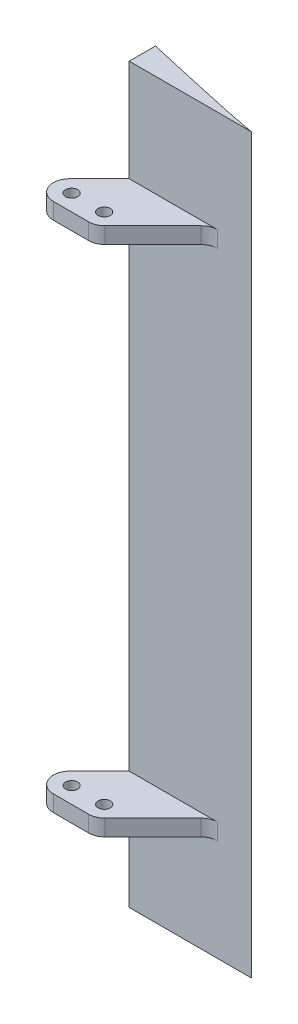
ISO-10303-21;
HEADER;
FILE_DESCRIPTION(('STEP AP214'),'2;1');
FILE_NAME('part.step','',(''),(''),'','','');
FILE_SCHEMA(('AUTOMOTIVE_DESIGN { 1 0 10303 214 1 1 1 1 }'));
ENDSEC;
DATA;
#1=APPLICATION_CONTEXT('core data for automotive mechanical design processes');
#2=APPLICATION_PROTOCOL_DEFINITION('international standard','automotive_design',2000,#1);
#3=PRODUCT_CONTEXT('',#1,'mechanical');
#4=PRODUCT('Part','Part','',(#3));
#5=PRODUCT_RELATED_PRODUCT_CATEGORY('part','',(#4));
#6=PRODUCT_DEFINITION_FORMATION('','',#4);
#7=PRODUCT_DEFINITION_CONTEXT('part definition',#1,'design');
#8=PRODUCT_DEFINITION('design','',#6,#7);
#9=PRODUCT_DEFINITION_SHAPE('','',#8);
#10=(LENGTH_UNIT() NAMED_UNIT(*) SI_UNIT(.MILLI.,.METRE.));
#11=(NAMED_UNIT(*) PLANE_ANGLE_UNIT() SI_UNIT($,.RADIAN.));
#12=(NAMED_UNIT(*) SI_UNIT($,.STERADIAN.) SOLID_ANGLE_UNIT());
#13=UNCERTAINTY_MEASURE_WITH_UNIT(LENGTH_MEASURE(1.E-05),#10,'distance_accuracy_value','');
#14=(GEOMETRIC_REPRESENTATION_CONTEXT(3) GLOBAL_UNCERTAINTY_ASSIGNED_CONTEXT((#13)) GLOBAL_UNIT_ASSIGNED_CONTEXT((#10,
#11,#12)) REPRESENTATION_CONTEXT('',''));
#15=CARTESIAN_POINT('',(0.,0.,0.));
#16=DIRECTION('',(0.,0.,1.));
#17=DIRECTION('',(1.,0.,0.));
#18=AXIS2_PLACEMENT_3D('',#15,#16,#17);
#19=CARTESIAN_POINT('',(-23.8351605851665,100.,0.));
#20=DIRECTION('',(0.,0.,-1.));
#21=DIRECTION('',(-1.,0.,0.));
#22=AXIS2_PLACEMENT_3D('',#19,#20,#21);
#23=PLANE('',#22);
#24=DIRECTION('',(1.,0.,0.));
#25=VECTOR('',#24,1.);
#26=CARTESIAN_POINT('',(11.1648394148335,19.5,0.));
#27=LINE('',#26,#25);
#28=CARTESIAN_POINT('',(11.1648394148335,19.5,0.));
#29=VERTEX_POINT('',#28);
#30=CARTESIAN_POINT('',(21.9932665395797,19.5,0.));
#31=VERTEX_POINT('',#30);
#32=EDGE_CURVE('E193',#29,#31,#27,.T.);
#33=ORIENTED_EDGE('',*,*,#32,.T.);
#34=DIRECTION('',(0.,1.,0.));
#35=VECTOR('',#34,1.);
#36=CARTESIAN_POINT('',(21.9932665395797,17.5,0.));
#37=LINE('',#36,#35);
#38=CARTESIAN_POINT('',(21.9932665395797,17.5,0.));
#39=VERTEX_POINT('',#38);
#40=EDGE_CURVE('E191',#31,#39,#37,.F.);
#41=ORIENTED_EDGE('',*,*,#40,.T.);
#42=DIRECTION('',(1.,0.,0.));
#43=VECTOR('',#42,1.);
#44=CARTESIAN_POINT('',(11.1648394148335,17.5,0.));
#45=LINE('',#44,#43);
#46=CARTESIAN_POINT('',(11.1648394148335,17.5,0.));
#47=VERTEX_POINT('',#46);
#48=EDGE_CURVE('E161',#47,#39,#45,.T.);
#49=ORIENTED_EDGE('',*,*,#48,.F.);
#50=DIRECTION('',(0.,-1.,0.));
#51=VECTOR('',#50,1.);
#52=CARTESIAN_POINT('',(11.1648394148335,100.,0.));
#53=LINE('',#52,#51);
#54=CARTESIAN_POINT('',(11.1648394148335,5.,0.));
#55=VERTEX_POINT('',#54);
#56=EDGE_CURVE('E176',#47,#55,#53,.T.);
#57=ORIENTED_EDGE('',*,*,#56,.T.);
#58=DIRECTION('',(1.,0.,0.));
#59=VECTOR('',#58,1.);
#60=CARTESIAN_POINT('',(-23.8351605851665,5.,0.));
#61=LINE('',#60,#59);
#62=CARTESIAN_POINT('',(26.1648394148335,5.,0.));
#63=VERTEX_POINT('',#62);
#64=EDGE_CURVE('E188',#55,#63,#61,.T.);
#65=ORIENTED_EDGE('',*,*,#64,.T.);
#66=DIRECTION('',(0.,-1.,0.));
#67=VECTOR('',#66,1.);
#68=CARTESIAN_POINT('',(26.1648394148335,100.,0.));
#69=LINE('',#68,#67);
#70=CARTESIAN_POINT('',(26.1648394148335,95.,0.));
#71=VERTEX_POINT('',#70);
#72=EDGE_CURVE('E259',#71,#63,#69,.T.);
#73=ORIENTED_EDGE('',*,*,#72,.F.);
#74=DIRECTION('',(-1.,0.,0.));
#75=VECTOR('',#74,1.);
#76=CARTESIAN_POINT('',(-23.8351605851665,95.,0.));
#77=LINE('',#76,#75);
#78=CARTESIAN_POINT('',(11.1648394148335,95.,0.));
#79=VERTEX_POINT('',#78);
#80=EDGE_CURVE('E233',#71,#79,#77,.T.);
#81=ORIENTED_EDGE('',*,*,#80,.T.);
#82=CARTESIAN_POINT('',(11.1648394148335,82.5,0.));
#83=VERTEX_POINT('',#82);
#84=EDGE_CURVE('E240',#79,#83,#53,.T.);
#85=ORIENTED_EDGE('',*,*,#84,.T.);
#86=DIRECTION('',(1.,0.,0.));
#87=VECTOR('',#86,1.);
#88=CARTESIAN_POINT('',(11.1648394148335,82.5,0.));
#89=LINE('',#88,#87);
#90=CARTESIAN_POINT('',(21.9932665395797,82.5,0.));
#91=VERTEX_POINT('',#90);
#92=EDGE_CURVE('E214',#83,#91,#89,.T.);
#93=ORIENTED_EDGE('',*,*,#92,.T.);
#94=DIRECTION('',(0.,-1.,0.));
#95=VECTOR('',#94,1.);
#96=CARTESIAN_POINT('',(21.9932665395797,99.9999999999999,0.));
#97=LINE('',#96,#95);
#98=CARTESIAN_POINT('',(21.9932665395797,80.5,0.));
#99=VERTEX_POINT('',#98);
#100=EDGE_CURVE('E357',#91,#99,#97,.T.);
#101=ORIENTED_EDGE('',*,*,#100,.T.);
#102=DIRECTION('',(1.,0.,0.));
#103=VECTOR('',#102,1.);
#104=CARTESIAN_POINT('',(11.1648394148335,80.5,0.));
#105=LINE('',#104,#103);
#106=CARTESIAN_POINT('',(11.1648394148335,80.5,0.));
#107=VERTEX_POINT('',#106);
#108=EDGE_CURVE('E202',#107,#99,#105,.T.);
#109=ORIENTED_EDGE('',*,*,#108,.F.);
#110=EDGE_CURVE('E187',#107,#29,#53,.T.);
#111=ORIENTED_EDGE('',*,*,#110,.T.);
#112=EDGE_LOOP('',(#33,#41,#49,#57,#65,#73,#81,#85,#93,#101,#109,#111));
#113=FACE_BOUND('',#112,.T.);
#114=ADVANCED_FACE('F33',(#113),#23,.F.);
#115=CARTESIAN_POINT('',(26.1648394148335,100.,0.));
#116=CARTESIAN_POINT('',(19.211918985571,100.,-1.16258018784965));
#117=CARTESIAN_POINT('',(4.13271292978012,100.,-5.52501275167282));
#118=CARTESIAN_POINT('',(-8.85012049649564,100.,-5.77485183788265));
#119=CARTESIAN_POINT('',(-18.7383931036189,100.,-4.79326831168846));
#120=CARTESIAN_POINT('',(-22.278212261763,100.,-3.55358612755049));
#121=CARTESIAN_POINT('',(-24.2675788953221,100.,-1.25622054621105));
#122=B_SPLINE_CURVE_WITH_KNOTS('',3,(#115,#116,#117,#118,#119,#120,#121),.UNSPECIFIED.,.F.,.F.,
(4,1,1,1,4),(0.0219972250878111,0.49085189361201,0.815811168310364,0.866725978949163,1.),.UNSPECIFIED.);
#123=DIRECTION('',(0.,-1.,0.));
#124=VECTOR('',#123,1.);
#125=SURFACE_OF_LINEAR_EXTRUSION('',#122,#124);
#126=DIRECTION('',(0.,-1.,0.));
#127=VECTOR('',#126,1.);
#128=CARTESIAN_POINT('',(11.1648394148335,100.,-3.22712026169733));
#129=LINE('',#128,#127);
#130=CARTESIAN_POINT('',(11.1648394148347,5.00000000000002,-3.22712026169708));
#131=VERTEX_POINT('',#130);
#132=CARTESIAN_POINT('',(11.1648394148335,95.,-3.22712026169733));
#133=VERTEX_POINT('',#132);
#134=EDGE_CURVE('E248',#131,#133,#129,.F.);
#135=ORIENTED_EDGE('',*,*,#134,.T.);
#136=CARTESIAN_POINT('',(26.1648394148335,95.,0.));
#137=CARTESIAN_POINT('',(19.211918985571,95.,-1.16258018784965));
#138=CARTESIAN_POINT('',(4.13271292978012,95.,-5.52501275167282));
#139=CARTESIAN_POINT('',(-8.85012049649564,95.,-5.77485183788265));
#140=CARTESIAN_POINT('',(-18.7383931036189,95.,-4.79326831168846));
#141=CARTESIAN_POINT('',(-22.278212261763,95.,-3.55358612755049));
#142=CARTESIAN_POINT('',(-24.2675788953221,95.,-1.25622054621105));
#143=B_SPLINE_CURVE_WITH_KNOTS('',3,(#136,#137,#138,#139,#140,#141,#142),.UNSPECIFIED.,.F.,.F.,
(4,1,1,1,4),(0.0219972250878111,0.49085189361201,0.815811168310364,0.866725978949163,1.),.UNSPECIFIED.);
#144=EDGE_CURVE('E243',#133,#71,#143,.F.);
#145=ORIENTED_EDGE('',*,*,#144,.T.);
#146=ORIENTED_EDGE('',*,*,#72,.T.);
#147=CARTESIAN_POINT('',(26.1648394148335,5.00000000000002,0.));
#148=CARTESIAN_POINT('',(19.211918985571,5.00000000000002,-1.16258018784965));
#149=CARTESIAN_POINT('',(4.13271292978012,5.00000000000002,-5.52501275167282));
#150=CARTESIAN_POINT('',(-8.85012049649564,5.00000000000002,-5.77485183788265));
#151=CARTESIAN_POINT('',(-18.7383931036189,5.00000000000002,-4.79326831168846));
#152=CARTESIAN_POINT('',(-22.278212261763,5.00000000000002,-3.55358612755049));
#153=CARTESIAN_POINT('',(-24.2675788953221,5.00000000000002,-1.25622054621105));
#154=B_SPLINE_CURVE_WITH_KNOTS('',3,(#147,#148,#149,#150,#151,#152,#153),.UNSPECIFIED.,.F.,.F.,
(4,1,1,1,4),(0.0219972250878111,0.49085189361201,0.815811168310364,0.866725978949163,1.),.UNSPECIFIED.);
#155=EDGE_CURVE('E254',#63,#131,#154,.T.);
#156=ORIENTED_EDGE('',*,*,#155,.T.);
#157=EDGE_LOOP('',(#135,#145,#146,#156));
#158=FACE_BOUND('',#157,.T.);
#159=ADVANCED_FACE('F271',(#158),#125,.F.);
#160=CARTESIAN_POINT('',(26.1648394148335,95.,-90.));
#161=DIRECTION('',(0.,-1.,0.));
#162=DIRECTION('',(0.,0.,-1.));
#163=AXIS2_PLACEMENT_3D('',#160,#161,#162);
#164=PLANE('',#163);
#165=ORIENTED_EDGE('',*,*,#144,.F.);
#166=DIRECTION('',(0.,0.,1.));
#167=VECTOR('',#166,1.);
#168=CARTESIAN_POINT('',(11.1648394148335,95.,-90.));
#169=LINE('',#168,#167);
#170=EDGE_CURVE('E442',#133,#79,#169,.T.);
#171=ORIENTED_EDGE('',*,*,#170,.T.);
#172=ORIENTED_EDGE('',*,*,#80,.F.);
#173=EDGE_LOOP('',(#165,#171,#172));
#174=FACE_BOUND('',#173,.T.);
#175=ADVANCED_FACE('F275',(#174),#164,.F.);
#176=CARTESIAN_POINT('',(11.1648394148335,95.,-90.));
#177=DIRECTION('',(1.,0.,0.));
#178=DIRECTION('',(0.,1.,0.));
#179=AXIS2_PLACEMENT_3D('',#176,#177,#178);
#180=PLANE('',#179);
#181=ORIENTED_EDGE('',*,*,#170,.F.);
#182=ORIENTED_EDGE('',*,*,#134,.F.);
#183=DIRECTION('',(0.,0.,1.));
#184=VECTOR('',#183,1.);
#185=CARTESIAN_POINT('',(11.1648394148335,5.,-90.));
#186=LINE('',#185,#184);
#187=EDGE_CURVE('E183',#131,#55,#186,.T.);
#188=ORIENTED_EDGE('',*,*,#187,.T.);
#189=ORIENTED_EDGE('',*,*,#56,.F.);
#190=DIRECTION('',(0.,1.,0.));
#191=VECTOR('',#190,1.);
#192=CARTESIAN_POINT('',(11.1648394148335,17.5,0.));
#193=LINE('',#192,#191);
#194=EDGE_CURVE('E180',#47,#29,#193,.T.);
#195=ORIENTED_EDGE('',*,*,#194,.T.);
#196=ORIENTED_EDGE('',*,*,#110,.F.);
#197=DIRECTION('',(0.,-1.,0.));
#198=VECTOR('',#197,1.);
#199=CARTESIAN_POINT('',(11.1648394148335,82.5,0.));
#200=LINE('',#199,#198);
#201=EDGE_CURVE('E199',#83,#107,#200,.T.);
#202=ORIENTED_EDGE('',*,*,#201,.F.);
#203=ORIENTED_EDGE('',*,*,#84,.F.);
#204=EDGE_LOOP('',(#181,#182,#188,#189,#195,#196,#202,#203));
#205=FACE_BOUND('',#204,.T.);
#206=ADVANCED_FACE('F178',(#205),#180,.F.);
#207=CARTESIAN_POINT('',(26.1648394148335,5.,-90.));
#208=DIRECTION('',(0.,1.,0.));
#209=DIRECTION('',(0.,0.,1.));
#210=AXIS2_PLACEMENT_3D('',#207,#208,#209);
#211=PLANE('',#210);
#212=ORIENTED_EDGE('',*,*,#187,.F.);
#213=ORIENTED_EDGE('',*,*,#155,.F.);
#214=ORIENTED_EDGE('',*,*,#64,.F.);
#215=EDGE_LOOP('',(#212,#213,#214));
#216=FACE_BOUND('',#215,.T.);
#217=ADVANCED_FACE('F277',(#216),#211,.F.);
#218=CARTESIAN_POINT('',(4.09377160296798,82.5,7.07106781186539));
#219=DIRECTION('',(0.707106781186539,0.,0.707106781186556));
#220=DIRECTION('',(0.707106781186556,0.,-0.707106781186539));
#221=AXIS2_PLACEMENT_3D('',#218,#219,#220);
#222=PLANE('',#221);
#223=DIRECTION('',(0.707106781186556,0.,-0.707106781186539));
#224=VECTOR('',#223,1.);
#225=CARTESIAN_POINT('',(4.09377160296798,80.5,7.07106781186539));
#226=LINE('',#225,#224);
#227=CARTESIAN_POINT('',(7.50798516534116,80.5,3.65685424949228));
#228=VERTEX_POINT('',#227);
#229=EDGE_CURVE('E380',#228,#107,#226,.T.);
#230=ORIENTED_EDGE('',*,*,#229,.F.);
#231=DIRECTION('',(0.,-1.,0.));
#232=VECTOR('',#231,1.);
#233=CARTESIAN_POINT('',(7.50798516534116,82.5,3.65685424949228));
#234=LINE('',#233,#232);
#235=CARTESIAN_POINT('',(7.50798516534116,82.5,3.65685424949228));
#236=VERTEX_POINT('',#235);
#237=EDGE_CURVE('E50',#228,#236,#234,.F.);
#238=ORIENTED_EDGE('',*,*,#237,.T.);
#239=DIRECTION('',(0.707106781186556,0.,-0.707106781186539));
#240=VECTOR('',#239,1.);
#241=CARTESIAN_POINT('',(4.09377160296798,82.5,7.07106781186539));
#242=LINE('',#241,#240);
#243=EDGE_CURVE('E216',#236,#83,#242,.T.);
#244=ORIENTED_EDGE('',*,*,#243,.T.);
#245=ORIENTED_EDGE('',*,*,#201,.T.);
#246=EDGE_LOOP('',(#230,#238,#244,#245));
#247=FACE_BOUND('',#246,.T.);
#248=ADVANCED_FACE('F410',(#247),#222,.F.);
#249=CARTESIAN_POINT('',(4.09377160296798,80.5,7.07106781186539));
#250=DIRECTION('',(0.,1.,0.));
#251=DIRECTION('',(0.,0.,1.));
#252=AXIS2_PLACEMENT_3D('',#249,#250,#251);
#253=PLANE('',#252);
#254=CARTESIAN_POINT('',(13.1648394148335,80.5,5.07106781186539));
#255=DIRECTION('',(0.,1.,0.));
#256=DIRECTION('',(0.,0.,1.));
#257=AXIS2_PLACEMENT_3D('',#254,#255,#256);
#258=CIRCLE('',#257,0.75);
#259=CARTESIAN_POINT('',(13.1648394148335,80.5,5.8210678118654));
#260=VERTEX_POINT('',#259);
#261=EDGE_CURVE('E333',#260,#260,#258,.T.);
#262=ORIENTED_EDGE('',*,*,#261,.T.);
#263=EDGE_LOOP('',(#262));
#264=FACE_BOUND('',#263,.T.);
#265=CARTESIAN_POINT('',(9.16483941483353,80.5,5.07106781186539));
#266=DIRECTION('',(0.,1.,0.));
#267=DIRECTION('',(0.,0.,1.));
#268=AXIS2_PLACEMENT_3D('',#265,#266,#267);
#269=CIRCLE('',#268,0.75);
#270=CARTESIAN_POINT('',(9.16483941483353,80.5,5.8210678118654));
#271=VERTEX_POINT('',#270);
#272=EDGE_CURVE('E171',#271,#271,#269,.T.);
#273=ORIENTED_EDGE('',*,*,#272,.T.);
#274=EDGE_LOOP('',(#273));
#275=FACE_BOUND('',#274,.T.);
#276=DIRECTION('',(0.707106781186556,0.,-0.707106781186539));
#277=VECTOR('',#276,1.);
#278=CARTESIAN_POINT('',(14.093771602968,80.5,7.07106781186539));
#279=LINE('',#278,#277);
#280=CARTESIAN_POINT('',(14.6795580405949,80.5,6.48528137423851));
#281=VERTEX_POINT('',#280);
#282=CARTESIAN_POINT('',(20.5790529772066,80.5,0.585786437626891));
#283=VERTEX_POINT('',#282);
#284=EDGE_CURVE('E383',#281,#283,#279,.T.);
#285=ORIENTED_EDGE('',*,*,#284,.F.);
#286=CARTESIAN_POINT('',(13.2653444782218,80.5,5.07106781186539));
#287=DIRECTION('',(0.,1.,0.));
#288=DIRECTION('',(0.,0.,1.));
#289=AXIS2_PLACEMENT_3D('',#286,#287,#288);
#290=CIRCLE('',#289,2.);
#291=CARTESIAN_POINT('',(13.2653444782218,80.5,7.07106781186539));
#292=VERTEX_POINT('',#291);
#293=EDGE_CURVE('E407',#281,#292,#290,.F.);
#294=ORIENTED_EDGE('',*,*,#293,.T.);
#295=DIRECTION('',(1.,0.,0.));
#296=VECTOR('',#295,1.);
#297=CARTESIAN_POINT('',(4.09377160296798,80.5,7.07106781186539));
#298=LINE('',#297,#296);
#299=CARTESIAN_POINT('',(8.92219872771424,80.5,7.07106781186539));
#300=VERTEX_POINT('',#299);
#301=EDGE_CURVE('E211',#300,#292,#298,.T.);
#302=ORIENTED_EDGE('',*,*,#301,.F.);
#303=CARTESIAN_POINT('',(8.92219872771424,80.5,5.07106781186539));
#304=DIRECTION('',(0.,1.,0.));
#305=DIRECTION('',(0.,0.,1.));
#306=AXIS2_PLACEMENT_3D('',#303,#304,#305);
#307=CIRCLE('',#306,2.);
#308=EDGE_CURVE('E379',#300,#228,#307,.F.);
#309=ORIENTED_EDGE('',*,*,#308,.T.);
#310=ORIENTED_EDGE('',*,*,#229,.T.);
#311=ORIENTED_EDGE('',*,*,#108,.T.);
#312=CARTESIAN_POINT('',(21.9932665395797,80.5,2.));
#313=DIRECTION('',(0.,1.,0.));
#314=DIRECTION('',(0.,0.,1.));
#315=AXIS2_PLACEMENT_3D('',#312,#313,#314);
#316=CIRCLE('',#315,2.);
#317=EDGE_CURVE('E42',#99,#283,#316,.T.);
#318=ORIENTED_EDGE('',*,*,#317,.T.);
#319=EDGE_LOOP('',(#285,#294,#302,#309,#310,#311,#318));
#320=FACE_BOUND('',#319,.T.);
#321=ADVANCED_FACE('F393',(#264,#275,#320),#253,.F.);
#322=CARTESIAN_POINT('',(14.093771602968,82.5,7.07106781186539));
#323=DIRECTION('',(0.707106781186539,0.,0.707106781186556));
#324=DIRECTION('',(0.707106781186556,0.,-0.707106781186539));
#325=AXIS2_PLACEMENT_3D('',#322,#323,#324);
#326=PLANE('',#325);
#327=ORIENTED_EDGE('',*,*,#284,.T.);
#328=DIRECTION('',(0.,-1.,0.));
#329=VECTOR('',#328,1.);
#330=CARTESIAN_POINT('',(20.5790529772066,82.5,0.585786437626891));
#331=LINE('',#330,#329);
#332=CARTESIAN_POINT('',(20.5790529772066,82.5,0.585786437626891));
#333=VERTEX_POINT('',#332);
#334=EDGE_CURVE('E377',#283,#333,#331,.F.);
#335=ORIENTED_EDGE('',*,*,#334,.T.);
#336=DIRECTION('',(0.707106781186556,0.,-0.707106781186539));
#337=VECTOR('',#336,1.);
#338=CARTESIAN_POINT('',(14.093771602968,82.5,7.07106781186539));
#339=LINE('',#338,#337);
#340=CARTESIAN_POINT('',(14.6795580405949,82.5,6.48528137423851));
#341=VERTEX_POINT('',#340);
#342=EDGE_CURVE('E219',#341,#333,#339,.T.);
#343=ORIENTED_EDGE('',*,*,#342,.F.);
#344=DIRECTION('',(0.,-1.,0.));
#345=VECTOR('',#344,1.);
#346=CARTESIAN_POINT('',(14.6795580405949,82.5,6.48528137423851));
#347=LINE('',#346,#345);
#348=EDGE_CURVE('E309',#341,#281,#347,.T.);
#349=ORIENTED_EDGE('',*,*,#348,.T.);
#350=EDGE_LOOP('',(#327,#335,#343,#349));
#351=FACE_BOUND('',#350,.T.);
#352=ADVANCED_FACE('F420',(#351),#326,.T.);
#353=CARTESIAN_POINT('',(4.09377160296798,82.5,7.07106781186539));
#354=DIRECTION('',(0.,1.,0.));
#355=DIRECTION('',(0.,0.,1.));
#356=AXIS2_PLACEMENT_3D('',#353,#354,#355);
#357=PLANE('',#356);
#358=CARTESIAN_POINT('',(13.1648394148335,82.5,5.07106781186539));
#359=DIRECTION('',(0.,1.,0.));
#360=DIRECTION('',(0.,0.,1.));
#361=AXIS2_PLACEMENT_3D('',#358,#359,#360);
#362=CIRCLE('',#361,0.75);
#363=CARTESIAN_POINT('',(13.1648394148335,82.5,5.8210678118654));
#364=VERTEX_POINT('',#363);
#365=EDGE_CURVE('E492',#364,#364,#362,.T.);
#366=ORIENTED_EDGE('',*,*,#365,.F.);
#367=EDGE_LOOP('',(#366));
#368=FACE_BOUND('',#367,.T.);
#369=CARTESIAN_POINT('',(9.16483941483353,82.5,5.07106781186539));
#370=DIRECTION('',(0.,1.,0.));
#371=DIRECTION('',(0.,0.,1.));
#372=AXIS2_PLACEMENT_3D('',#369,#370,#371);
#373=CIRCLE('',#372,0.75);
#374=CARTESIAN_POINT('',(9.16483941483353,82.5,5.8210678118654));
#375=VERTEX_POINT('',#374);
#376=EDGE_CURVE('E327',#375,#375,#373,.T.);
#377=ORIENTED_EDGE('',*,*,#376,.F.);
#378=EDGE_LOOP('',(#377));
#379=FACE_BOUND('',#378,.T.);
#380=DIRECTION('',(1.,0.,0.));
#381=VECTOR('',#380,1.);
#382=CARTESIAN_POINT('',(4.09377160296798,82.5,7.07106781186539));
#383=LINE('',#382,#381);
#384=CARTESIAN_POINT('',(8.92219872771424,82.5,7.07106781186539));
#385=VERTEX_POINT('',#384);
#386=CARTESIAN_POINT('',(13.2653444782218,82.5,7.07106781186539));
#387=VERTEX_POINT('',#386);
#388=EDGE_CURVE('E213',#385,#387,#383,.T.);
#389=ORIENTED_EDGE('',*,*,#388,.T.);
#390=CARTESIAN_POINT('',(13.2653444782218,82.5,5.07106781186539));
#391=DIRECTION('',(0.,1.,0.));
#392=DIRECTION('',(0.,0.,1.));
#393=AXIS2_PLACEMENT_3D('',#390,#391,#392);
#394=CIRCLE('',#393,2.);
#395=EDGE_CURVE('E307',#387,#341,#394,.T.);
#396=ORIENTED_EDGE('',*,*,#395,.T.);
#397=ORIENTED_EDGE('',*,*,#342,.T.);
#398=CARTESIAN_POINT('',(21.9932665395797,82.5,2.));
#399=DIRECTION('',(0.,1.,0.));
#400=DIRECTION('',(0.,0.,1.));
#401=AXIS2_PLACEMENT_3D('',#398,#399,#400);
#402=CIRCLE('',#401,2.);
#403=EDGE_CURVE('E11',#333,#91,#402,.F.);
#404=ORIENTED_EDGE('',*,*,#403,.T.);
#405=ORIENTED_EDGE('',*,*,#92,.F.);
#406=ORIENTED_EDGE('',*,*,#243,.F.);
#407=CARTESIAN_POINT('',(8.92219872771424,82.5,5.07106781186539));
#408=DIRECTION('',(0.,1.,0.));
#409=DIRECTION('',(0.,0.,1.));
#410=AXIS2_PLACEMENT_3D('',#407,#408,#409);
#411=CIRCLE('',#410,2.);
#412=EDGE_CURVE('E313',#236,#385,#411,.T.);
#413=ORIENTED_EDGE('',*,*,#412,.T.);
#414=EDGE_LOOP('',(#389,#396,#397,#404,#405,#406,#413));
#415=FACE_BOUND('',#414,.T.);
#416=ADVANCED_FACE('F400',(#368,#379,#415),#357,.T.);
#417=CARTESIAN_POINT('',(-7.07106781186556,0.,7.07106781186539));
#418=DIRECTION('',(0.,0.,1.));
#419=DIRECTION('',(1.,0.,0.));
#420=AXIS2_PLACEMENT_3D('',#417,#418,#419);
#421=PLANE('',#420);
#422=ORIENTED_EDGE('',*,*,#301,.T.);
#423=DIRECTION('',(0.,-1.,0.));
#424=VECTOR('',#423,1.);
#425=CARTESIAN_POINT('',(13.2653444782217,0.,7.07106781186539));
#426=LINE('',#425,#424);
#427=EDGE_CURVE('E58',#292,#387,#426,.F.);
#428=ORIENTED_EDGE('',*,*,#427,.T.);
#429=ORIENTED_EDGE('',*,*,#388,.F.);
#430=DIRECTION('',(0.,-1.,0.));
#431=VECTOR('',#430,1.);
#432=CARTESIAN_POINT('',(8.92219872771424,80.5,7.07106781186539));
#433=LINE('',#432,#431);
#434=EDGE_CURVE('E405',#385,#300,#433,.T.);
#435=ORIENTED_EDGE('',*,*,#434,.T.);
#436=EDGE_LOOP('',(#422,#428,#429,#435));
#437=FACE_BOUND('',#436,.T.);
#438=ADVANCED_FACE('F412',(#437),#421,.T.);
#439=CARTESIAN_POINT('',(4.09377160296798,17.5,7.07106781186539));
#440=DIRECTION('',(-0.707106781186539,0.,-0.707106781186556));
#441=DIRECTION('',(-0.707106781186556,0.,0.707106781186539));
#442=AXIS2_PLACEMENT_3D('',#439,#440,#441);
#443=PLANE('',#442);
#444=DIRECTION('',(0.707106781186556,0.,-0.707106781186539));
#445=VECTOR('',#444,1.);
#446=CARTESIAN_POINT('',(4.09377160296798,17.5,7.07106781186539));
#447=LINE('',#446,#445);
#448=CARTESIAN_POINT('',(7.50798516534116,17.5,3.65685424949228));
#449=VERTEX_POINT('',#448);
#450=EDGE_CURVE('E156',#449,#47,#447,.T.);
#451=ORIENTED_EDGE('',*,*,#450,.F.);
#452=DIRECTION('',(0.,1.,0.));
#453=VECTOR('',#452,1.);
#454=CARTESIAN_POINT('',(7.50798516534116,19.5,3.65685424949228));
#455=LINE('',#454,#453);
#456=CARTESIAN_POINT('',(7.50798516534116,19.5,3.65685424949228));
#457=VERTEX_POINT('',#456);
#458=EDGE_CURVE('E374',#449,#457,#455,.T.);
#459=ORIENTED_EDGE('',*,*,#458,.T.);
#460=DIRECTION('',(0.707106781186556,0.,-0.707106781186539));
#461=VECTOR('',#460,1.);
#462=CARTESIAN_POINT('',(4.09377160296798,19.5,7.07106781186539));
#463=LINE('',#462,#461);
#464=EDGE_CURVE('E198',#457,#29,#463,.T.);
#465=ORIENTED_EDGE('',*,*,#464,.T.);
#466=ORIENTED_EDGE('',*,*,#194,.F.);
#467=EDGE_LOOP('',(#451,#459,#465,#466));
#468=FACE_BOUND('',#467,.T.);
#469=ADVANCED_FACE('F196',(#468),#443,.T.);
#470=CARTESIAN_POINT('',(4.09377160296798,17.5,7.07106781186539));
#471=DIRECTION('',(0.,1.,0.));
#472=DIRECTION('',(0.,0.,1.));
#473=AXIS2_PLACEMENT_3D('',#470,#471,#472);
#474=PLANE('',#473);
#475=CARTESIAN_POINT('',(13.1648394148335,17.5,5.07106781186539));
#476=DIRECTION('',(0.,1.,0.));
#477=DIRECTION('',(0.,0.,1.));
#478=AXIS2_PLACEMENT_3D('',#475,#476,#477);
#479=CIRCLE('',#478,0.75);
#480=CARTESIAN_POINT('',(13.1648394148335,17.5,5.8210678118654));
#481=VERTEX_POINT('',#480);
#482=EDGE_CURVE('E338',#481,#481,#479,.T.);
#483=ORIENTED_EDGE('',*,*,#482,.T.);
#484=EDGE_LOOP('',(#483));
#485=FACE_BOUND('',#484,.T.);
#486=CARTESIAN_POINT('',(9.16483941483353,17.5,5.07106781186539));
#487=DIRECTION('',(0.,1.,0.));
#488=DIRECTION('',(0.,0.,1.));
#489=AXIS2_PLACEMENT_3D('',#486,#487,#488);
#490=CIRCLE('',#489,0.75);
#491=CARTESIAN_POINT('',(9.16483941483353,17.5,5.8210678118654));
#492=VERTEX_POINT('',#491);
#493=EDGE_CURVE('E326',#492,#492,#490,.T.);
#494=ORIENTED_EDGE('',*,*,#493,.T.);
#495=EDGE_LOOP('',(#494));
#496=FACE_BOUND('',#495,.T.);
#497=DIRECTION('',(0.707106781186556,0.,-0.707106781186539));
#498=VECTOR('',#497,1.);
#499=CARTESIAN_POINT('',(14.093771602968,17.5,7.07106781186539));
#500=LINE('',#499,#498);
#501=CARTESIAN_POINT('',(14.6795580405949,17.5,6.48528137423851));
#502=VERTEX_POINT('',#501);
#503=CARTESIAN_POINT('',(20.5790529772066,17.5,0.585786437626888));
#504=VERTEX_POINT('',#503);
#505=EDGE_CURVE('E170',#502,#504,#500,.T.);
#506=ORIENTED_EDGE('',*,*,#505,.F.);
#507=CARTESIAN_POINT('',(13.2653444782218,17.5,5.07106781186539));
#508=DIRECTION('',(0.,1.,0.));
#509=DIRECTION('',(0.,0.,1.));
#510=AXIS2_PLACEMENT_3D('',#507,#508,#509);
#511=CIRCLE('',#510,2.);
#512=CARTESIAN_POINT('',(13.2653444782218,17.5,7.07106781186539));
#513=VERTEX_POINT('',#512);
#514=EDGE_CURVE('E372',#502,#513,#511,.F.);
#515=ORIENTED_EDGE('',*,*,#514,.T.);
#516=DIRECTION('',(1.,0.,0.));
#517=VECTOR('',#516,1.);
#518=CARTESIAN_POINT('',(4.09377160296798,17.5,7.07106781186539));
#519=LINE('',#518,#517);
#520=CARTESIAN_POINT('',(8.92219872771424,17.5,7.07106781186539));
#521=VERTEX_POINT('',#520);
#522=EDGE_CURVE('E206',#521,#513,#519,.T.);
#523=ORIENTED_EDGE('',*,*,#522,.F.);
#524=CARTESIAN_POINT('',(8.92219872771424,17.5,5.07106781186539));
#525=DIRECTION('',(0.,1.,0.));
#526=DIRECTION('',(0.,0.,1.));
#527=AXIS2_PLACEMENT_3D('',#524,#525,#526);
#528=CIRCLE('',#527,2.);
#529=EDGE_CURVE('E165',#521,#449,#528,.F.);
#530=ORIENTED_EDGE('',*,*,#529,.T.);
#531=ORIENTED_EDGE('',*,*,#450,.T.);
#532=ORIENTED_EDGE('',*,*,#48,.T.);
#533=CARTESIAN_POINT('',(21.9932665395797,17.5,2.));
#534=DIRECTION('',(0.,1.,0.));
#535=DIRECTION('',(0.,0.,1.));
#536=AXIS2_PLACEMENT_3D('',#533,#534,#535);
#537=CIRCLE('',#536,2.);
#538=EDGE_CURVE('E322',#39,#504,#537,.T.);
#539=ORIENTED_EDGE('',*,*,#538,.T.);
#540=EDGE_LOOP('',(#506,#515,#523,#530,#531,#532,#539));
#541=FACE_BOUND('',#540,.T.);
#542=ADVANCED_FACE('F159',(#485,#496,#541),#474,.F.);
#543=CARTESIAN_POINT('',(14.093771602968,17.5,7.07106781186539));
#544=DIRECTION('',(-0.707106781186539,0.,-0.707106781186556));
#545=DIRECTION('',(-0.707106781186556,0.,0.707106781186539));
#546=AXIS2_PLACEMENT_3D('',#543,#544,#545);
#547=PLANE('',#546);
#548=ORIENTED_EDGE('',*,*,#505,.T.);
#549=DIRECTION('',(0.,1.,0.));
#550=VECTOR('',#549,1.);
#551=CARTESIAN_POINT('',(20.5790529772066,19.5,0.585786437626888));
#552=LINE('',#551,#550);
#553=CARTESIAN_POINT('',(20.5790529772066,19.5,0.585786437626888));
#554=VERTEX_POINT('',#553);
#555=EDGE_CURVE('E354',#504,#554,#552,.T.);
#556=ORIENTED_EDGE('',*,*,#555,.T.);
#557=DIRECTION('',(0.707106781186556,0.,-0.707106781186539));
#558=VECTOR('',#557,1.);
#559=CARTESIAN_POINT('',(14.093771602968,19.5,7.07106781186539));
#560=LINE('',#559,#558);
#561=CARTESIAN_POINT('',(14.6795580405949,19.5,6.48528137423851));
#562=VERTEX_POINT('',#561);
#563=EDGE_CURVE('E345',#562,#554,#560,.T.);
#564=ORIENTED_EDGE('',*,*,#563,.F.);
#565=DIRECTION('',(0.,1.,0.));
#566=VECTOR('',#565,1.);
#567=CARTESIAN_POINT('',(14.6795580405949,17.5,6.48528137423851));
#568=LINE('',#567,#566);
#569=EDGE_CURVE('E227',#562,#502,#568,.F.);
#570=ORIENTED_EDGE('',*,*,#569,.T.);
#571=EDGE_LOOP('',(#548,#556,#564,#570));
#572=FACE_BOUND('',#571,.T.);
#573=ADVANCED_FACE('F352',(#572),#547,.F.);
#574=CARTESIAN_POINT('',(4.09377160296798,19.5,7.07106781186539));
#575=DIRECTION('',(0.,1.,0.));
#576=DIRECTION('',(0.,0.,1.));
#577=AXIS2_PLACEMENT_3D('',#574,#575,#576);
#578=PLANE('',#577);
#579=CARTESIAN_POINT('',(13.1648394148335,19.5,5.07106781186539));
#580=DIRECTION('',(0.,1.,0.));
#581=DIRECTION('',(0.,0.,1.));
#582=AXIS2_PLACEMENT_3D('',#579,#580,#581);
#583=CIRCLE('',#582,0.75);
#584=CARTESIAN_POINT('',(13.1648394148335,19.5,5.8210678118654));
#585=VERTEX_POINT('',#584);
#586=EDGE_CURVE('E37',#585,#585,#583,.T.);
#587=ORIENTED_EDGE('',*,*,#586,.F.);
#588=EDGE_LOOP('',(#587));
#589=FACE_BOUND('',#588,.T.);
#590=CARTESIAN_POINT('',(9.16483941483353,19.5,5.07106781186539));
#591=DIRECTION('',(0.,1.,0.));
#592=DIRECTION('',(0.,0.,1.));
#593=AXIS2_PLACEMENT_3D('',#590,#591,#592);
#594=CIRCLE('',#593,0.75);
#595=CARTESIAN_POINT('',(9.16483941483353,19.5,5.8210678118654));
#596=VERTEX_POINT('',#595);
#597=EDGE_CURVE('E324',#596,#596,#594,.T.);
#598=ORIENTED_EDGE('',*,*,#597,.F.);
#599=EDGE_LOOP('',(#598));
#600=FACE_BOUND('',#599,.T.);
#601=DIRECTION('',(1.,0.,0.));
#602=VECTOR('',#601,1.);
#603=CARTESIAN_POINT('',(4.09377160296798,19.5,7.07106781186539));
#604=LINE('',#603,#602);
#605=CARTESIAN_POINT('',(8.92219872771424,19.5,7.07106781186539));
#606=VERTEX_POINT('',#605);
#607=CARTESIAN_POINT('',(13.2653444782218,19.5,7.07106781186539));
#608=VERTEX_POINT('',#607);
#609=EDGE_CURVE('E194',#606,#608,#604,.T.);
#610=ORIENTED_EDGE('',*,*,#609,.T.);
#611=CARTESIAN_POINT('',(13.2653444782218,19.5,5.07106781186539));
#612=DIRECTION('',(0.,1.,0.));
#613=DIRECTION('',(0.,0.,1.));
#614=AXIS2_PLACEMENT_3D('',#611,#612,#613);
#615=CIRCLE('',#614,2.);
#616=EDGE_CURVE('E369',#608,#562,#615,.T.);
#617=ORIENTED_EDGE('',*,*,#616,.T.);
#618=ORIENTED_EDGE('',*,*,#563,.T.);
#619=CARTESIAN_POINT('',(21.9932665395797,19.5,2.));
#620=DIRECTION('',(0.,1.,0.));
#621=DIRECTION('',(0.,0.,1.));
#622=AXIS2_PLACEMENT_3D('',#619,#620,#621);
#623=CIRCLE('',#622,2.);
#624=EDGE_CURVE('E315',#554,#31,#623,.F.);
#625=ORIENTED_EDGE('',*,*,#624,.T.);
#626=ORIENTED_EDGE('',*,*,#32,.F.);
#627=ORIENTED_EDGE('',*,*,#464,.F.);
#628=CARTESIAN_POINT('',(8.92219872771424,19.5,5.07106781186539));
#629=DIRECTION('',(0.,1.,0.));
#630=DIRECTION('',(0.,0.,1.));
#631=AXIS2_PLACEMENT_3D('',#628,#629,#630);
#632=CIRCLE('',#631,2.);
#633=EDGE_CURVE('E367',#457,#606,#632,.T.);
#634=ORIENTED_EDGE('',*,*,#633,.T.);
#635=EDGE_LOOP('',(#610,#617,#618,#625,#626,#627,#634));
#636=FACE_BOUND('',#635,.T.);
#637=ADVANCED_FACE('F448',(#589,#600,#636),#578,.T.);
#638=CARTESIAN_POINT('',(-7.07106781186556,0.,7.07106781186539));
#639=DIRECTION('',(0.,0.,-1.));
#640=DIRECTION('',(-1.,0.,0.));
#641=AXIS2_PLACEMENT_3D('',#638,#639,#640);
#642=PLANE('',#641);
#643=ORIENTED_EDGE('',*,*,#522,.T.);
#644=DIRECTION('',(0.,1.,0.));
#645=VECTOR('',#644,1.);
#646=CARTESIAN_POINT('',(13.2653444782218,0.,7.07106781186539));
#647=LINE('',#646,#645);
#648=EDGE_CURVE('E364',#513,#608,#647,.T.);
#649=ORIENTED_EDGE('',*,*,#648,.T.);
#650=ORIENTED_EDGE('',*,*,#609,.F.);
#651=DIRECTION('',(0.,1.,0.));
#652=VECTOR('',#651,1.);
#653=CARTESIAN_POINT('',(8.92219872771424,17.5,7.07106781186539));
#654=LINE('',#653,#652);
#655=EDGE_CURVE('E362',#606,#521,#654,.F.);
#656=ORIENTED_EDGE('',*,*,#655,.T.);
#657=EDGE_LOOP('',(#643,#649,#650,#656));
#658=FACE_BOUND('',#657,.T.);
#659=ADVANCED_FACE('F285',(#658),#642,.F.);
#660=CARTESIAN_POINT('',(21.9932665395797,17.5,2.));
#661=DIRECTION('',(0.,-1.,0.));
#662=DIRECTION('',(0.,0.,-1.));
#663=AXIS2_PLACEMENT_3D('',#660,#661,#662);
#664=CYLINDRICAL_SURFACE('',#663,2.);
#665=ORIENTED_EDGE('',*,*,#538,.F.);
#666=ORIENTED_EDGE('',*,*,#40,.F.);
#667=ORIENTED_EDGE('',*,*,#624,.F.);
#668=ORIENTED_EDGE('',*,*,#555,.F.);
#669=EDGE_LOOP('',(#665,#666,#667,#668));
#670=FACE_BOUND('',#669,.T.);
#671=ADVANCED_FACE('F281',(#670),#664,.F.);
#672=CARTESIAN_POINT('',(13.2653444782218,0.,5.07106781186539));
#673=DIRECTION('',(0.,1.,0.));
#674=DIRECTION('',(0.,0.,1.));
#675=AXIS2_PLACEMENT_3D('',#672,#673,#674);
#676=CYLINDRICAL_SURFACE('',#675,2.);
#677=ORIENTED_EDGE('',*,*,#514,.F.);
#678=ORIENTED_EDGE('',*,*,#569,.F.);
#679=ORIENTED_EDGE('',*,*,#616,.F.);
#680=ORIENTED_EDGE('',*,*,#648,.F.);
#681=EDGE_LOOP('',(#677,#678,#679,#680));
#682=FACE_BOUND('',#681,.T.);
#683=ADVANCED_FACE('F284',(#682),#676,.T.);
#684=CARTESIAN_POINT('',(8.92219872771424,17.5,5.07106781186539));
#685=DIRECTION('',(0.,-1.,0.));
#686=DIRECTION('',(0.,0.,-1.));
#687=AXIS2_PLACEMENT_3D('',#684,#685,#686);
#688=CYLINDRICAL_SURFACE('',#687,2.);
#689=ORIENTED_EDGE('',*,*,#529,.F.);
#690=ORIENTED_EDGE('',*,*,#655,.F.);
#691=ORIENTED_EDGE('',*,*,#633,.F.);
#692=ORIENTED_EDGE('',*,*,#458,.F.);
#693=EDGE_LOOP('',(#689,#690,#691,#692));
#694=FACE_BOUND('',#693,.T.);
#695=ADVANCED_FACE('F289',(#694),#688,.T.);
#696=CARTESIAN_POINT('',(21.9932665395797,99.9999999999999,2.));
#697=DIRECTION('',(0.,-1.,0.));
#698=DIRECTION('',(1.,0.,0.));
#699=AXIS2_PLACEMENT_3D('',#696,#697,#698);
#700=CYLINDRICAL_SURFACE('',#699,2.);
#701=ORIENTED_EDGE('',*,*,#403,.F.);
#702=ORIENTED_EDGE('',*,*,#334,.F.);
#703=ORIENTED_EDGE('',*,*,#317,.F.);
#704=ORIENTED_EDGE('',*,*,#100,.F.);
#705=EDGE_LOOP('',(#701,#702,#703,#704));
#706=FACE_BOUND('',#705,.T.);
#707=ADVANCED_FACE('F293',(#706),#700,.F.);
#708=CARTESIAN_POINT('',(13.2653444782218,82.5,5.07106781186539));
#709=DIRECTION('',(0.,-1.,0.));
#710=DIRECTION('',(1.,0.,0.));
#711=AXIS2_PLACEMENT_3D('',#708,#709,#710);
#712=CYLINDRICAL_SURFACE('',#711,2.);
#713=ORIENTED_EDGE('',*,*,#395,.F.);
#714=ORIENTED_EDGE('',*,*,#427,.F.);
#715=ORIENTED_EDGE('',*,*,#293,.F.);
#716=ORIENTED_EDGE('',*,*,#348,.F.);
#717=EDGE_LOOP('',(#713,#714,#715,#716));
#718=FACE_BOUND('',#717,.T.);
#719=ADVANCED_FACE('F296',(#718),#712,.T.);
#720=CARTESIAN_POINT('',(8.92219872771424,0.,5.07106781186539));
#721=DIRECTION('',(0.,1.,0.));
#722=DIRECTION('',(0.,0.,1.));
#723=AXIS2_PLACEMENT_3D('',#720,#721,#722);
#724=CYLINDRICAL_SURFACE('',#723,2.);
#725=ORIENTED_EDGE('',*,*,#412,.F.);
#726=ORIENTED_EDGE('',*,*,#237,.F.);
#727=ORIENTED_EDGE('',*,*,#308,.F.);
#728=ORIENTED_EDGE('',*,*,#434,.F.);
#729=EDGE_LOOP('',(#725,#726,#727,#728));
#730=FACE_BOUND('',#729,.T.);
#731=ADVANCED_FACE('F35',(#730),#724,.T.);
#732=CARTESIAN_POINT('',(9.16483941483353,-27.5,5.07106781186539));
#733=DIRECTION('',(0.,1.,0.));
#734=DIRECTION('',(0.,0.,1.));
#735=AXIS2_PLACEMENT_3D('',#732,#733,#734);
#736=CYLINDRICAL_SURFACE('',#735,0.75);
#737=ORIENTED_EDGE('',*,*,#597,.T.);
#738=EDGE_LOOP('',(#737));
#739=FACE_BOUND('',#738,.T.);
#740=ORIENTED_EDGE('',*,*,#493,.F.);
#741=EDGE_LOOP('',(#740));
#742=FACE_BOUND('',#741,.T.);
#743=ADVANCED_FACE('F303',(#739,#742),#736,.F.);
#744=ORIENTED_EDGE('',*,*,#376,.T.);
#745=EDGE_LOOP('',(#744));
#746=FACE_BOUND('',#745,.T.);
#747=ORIENTED_EDGE('',*,*,#272,.F.);
#748=EDGE_LOOP('',(#747));
#749=FACE_BOUND('',#748,.T.);
#750=ADVANCED_FACE('F476',(#746,#749),#736,.F.);
#751=CARTESIAN_POINT('',(13.1648394148335,-27.5,5.07106781186539));
#752=DIRECTION('',(0.,1.,0.));
#753=DIRECTION('',(0.,0.,1.));
#754=AXIS2_PLACEMENT_3D('',#751,#752,#753);
#755=CYLINDRICAL_SURFACE('',#754,0.75);
#756=ORIENTED_EDGE('',*,*,#586,.T.);
#757=EDGE_LOOP('',(#756));
#758=FACE_BOUND('',#757,.T.);
#759=ORIENTED_EDGE('',*,*,#482,.F.);
#760=EDGE_LOOP('',(#759));
#761=FACE_BOUND('',#760,.T.);
#762=ADVANCED_FACE('F480',(#758,#761),#755,.F.);
#763=ORIENTED_EDGE('',*,*,#365,.T.);
#764=EDGE_LOOP('',(#763));
#765=FACE_BOUND('',#764,.T.);
#766=ORIENTED_EDGE('',*,*,#261,.F.);
#767=EDGE_LOOP('',(#766));
#768=FACE_BOUND('',#767,.T.);
#769=ADVANCED_FACE('F482',(#765,#768),#755,.F.);
#770=CLOSED_SHELL('',(#114,#159,#175,#206,#217,#248,#321,#352,#416,#438,#469,#542,#573,#637,
#659,#671,#683,#695,#707,#719,#731,#743,#750,#762,#769));
#771=MANIFOLD_SOLID_BREP('B2',#770);
#772=ADVANCED_BREP_SHAPE_REPRESENTATION('',(#18,#771),#14);
#773=SHAPE_DEFINITION_REPRESENTATION(#9,#772);
ENDSEC;
END-ISO-10303-21;
